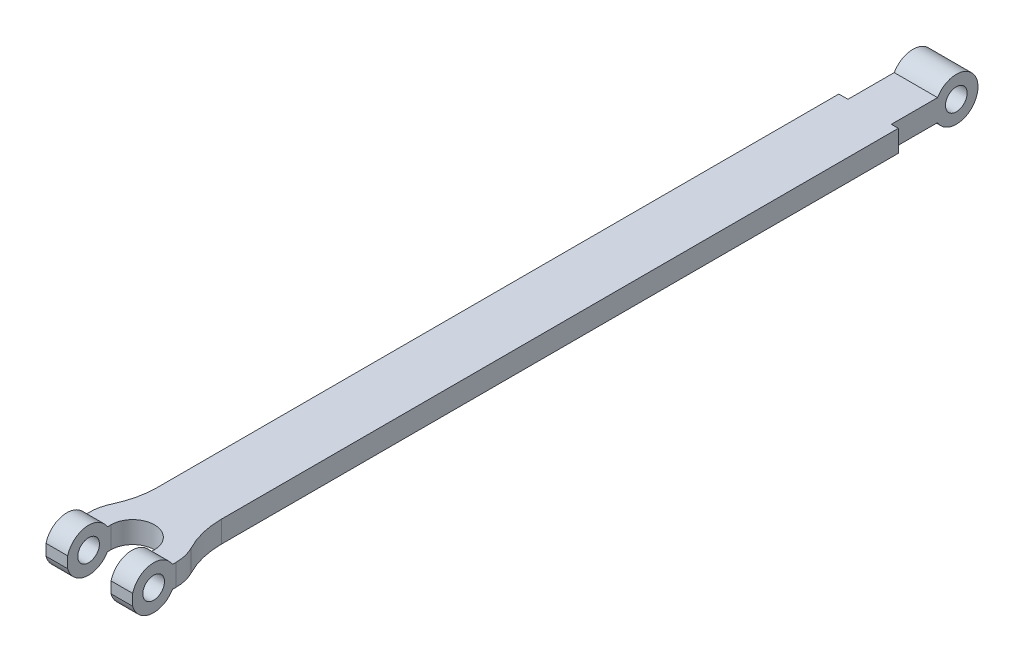
ISO-10303-21;
HEADER;
FILE_DESCRIPTION(('STEP AP214'),'2;1');
FILE_NAME('part.step','',(''),(''),'','','');
FILE_SCHEMA(('AUTOMOTIVE_DESIGN { 1 0 10303 214 1 1 1 1 }'));
ENDSEC;
DATA;
#1=APPLICATION_CONTEXT('core data for automotive mechanical design processes');
#2=APPLICATION_PROTOCOL_DEFINITION('international standard','automotive_design',2000,#1);
#3=PRODUCT_CONTEXT('',#1,'mechanical');
#4=PRODUCT('Part','Part','',(#3));
#5=PRODUCT_RELATED_PRODUCT_CATEGORY('part','',(#4));
#6=PRODUCT_DEFINITION_FORMATION('','',#4);
#7=PRODUCT_DEFINITION_CONTEXT('part definition',#1,'design');
#8=PRODUCT_DEFINITION('design','',#6,#7);
#9=PRODUCT_DEFINITION_SHAPE('','',#8);
#10=(LENGTH_UNIT() NAMED_UNIT(*) SI_UNIT(.MILLI.,.METRE.));
#11=(NAMED_UNIT(*) PLANE_ANGLE_UNIT() SI_UNIT($,.RADIAN.));
#12=(NAMED_UNIT(*) SI_UNIT($,.STERADIAN.) SOLID_ANGLE_UNIT());
#13=UNCERTAINTY_MEASURE_WITH_UNIT(LENGTH_MEASURE(1.E-05),#10,'distance_accuracy_value','');
#14=(GEOMETRIC_REPRESENTATION_CONTEXT(3) GLOBAL_UNCERTAINTY_ASSIGNED_CONTEXT((#13)) GLOBAL_UNIT_ASSIGNED_CONTEXT((#10,
#11,#12)) REPRESENTATION_CONTEXT('',''));
#15=CARTESIAN_POINT('',(0.,0.,0.));
#16=DIRECTION('',(0.,0.,1.));
#17=DIRECTION('',(1.,0.,0.));
#18=AXIS2_PLACEMENT_3D('',#15,#16,#17);
#19=CARTESIAN_POINT('',(-4.99999999999999,10.,0.));
#20=DIRECTION('',(-1.,0.,0.));
#21=DIRECTION('',(0.,0.,1.));
#22=AXIS2_PLACEMENT_3D('',#19,#20,#21);
#23=PLANE('',#22);
#24=CARTESIAN_POINT('',(-4.99999999999999,5.,-135.16461623257));
#25=DIRECTION('',(-1.,0.,0.));
#26=DIRECTION('',(0.,0.,1.));
#27=AXIS2_PLACEMENT_3D('',#24,#25,#26);
#28=CIRCLE('',#27,2.5);
#29=CARTESIAN_POINT('',(-4.99999999999999,5.,-132.66461623257));
#30=VERTEX_POINT('',#29);
#31=EDGE_CURVE('E390',#30,#30,#28,.T.);
#32=ORIENTED_EDGE('',*,*,#31,.F.);
#33=EDGE_LOOP('',(#32));
#34=FACE_BOUND('',#33,.T.);
#35=CARTESIAN_POINT('',(-4.99999999999999,5.,-135.16461623257));
#36=DIRECTION('',(-1.,0.,0.));
#37=DIRECTION('',(0.,0.,1.));
#38=AXIS2_PLACEMENT_3D('',#35,#36,#37);
#39=CIRCLE('',#38,4.99999999999999);
#40=CARTESIAN_POINT('',(-4.99999999999999,7.5,-130.834489213648));
#41=VERTEX_POINT('',#40);
#42=CARTESIAN_POINT('',(-4.99999999999999,2.50000000000001,-130.834489213648));
#43=VERTEX_POINT('',#42);
#44=EDGE_CURVE('E488',#41,#43,#39,.T.);
#45=ORIENTED_EDGE('',*,*,#44,.T.);
#46=DIRECTION('',(0.,0.,1.));
#47=VECTOR('',#46,1.);
#48=CARTESIAN_POINT('',(-4.99999999999999,2.5,0.));
#49=LINE('',#48,#47);
#50=CARTESIAN_POINT('',(-4.99999999999999,2.50000000000001,-120.16461623257));
#51=VERTEX_POINT('',#50);
#52=EDGE_CURVE('E386',#43,#51,#49,.T.);
#53=ORIENTED_EDGE('',*,*,#52,.T.);
#54=DIRECTION('',(0.,-1.,0.));
#55=VECTOR('',#54,1.);
#56=CARTESIAN_POINT('',(-4.99999999999999,10.,-120.16461623257));
#57=LINE('',#56,#55);
#58=CARTESIAN_POINT('',(-4.99999999999999,7.5,-120.16461623257));
#59=VERTEX_POINT('',#58);
#60=EDGE_CURVE('E548',#59,#51,#57,.T.);
#61=ORIENTED_EDGE('',*,*,#60,.F.);
#62=DIRECTION('',(0.,0.,1.));
#63=VECTOR('',#62,1.);
#64=CARTESIAN_POINT('',(-4.99999999999999,7.5,0.));
#65=LINE('',#64,#63);
#66=EDGE_CURVE('E457',#41,#59,#65,.T.);
#67=ORIENTED_EDGE('',*,*,#66,.F.);
#68=EDGE_LOOP('',(#45,#53,#61,#67));
#69=FACE_BOUND('',#68,.T.);
#70=ADVANCED_FACE('F158',(#34,#69),#23,.T.);
#71=CARTESIAN_POINT('',(-10.,10.,0.));
#72=DIRECTION('',(-1.,0.,0.));
#73=DIRECTION('',(0.,0.,1.));
#74=AXIS2_PLACEMENT_3D('',#71,#72,#73);
#75=PLANE('',#74);
#76=CARTESIAN_POINT('',(-10.,5.,55.0055015003828));
#77=DIRECTION('',(-1.,0.,0.));
#78=DIRECTION('',(0.,0.,1.));
#79=AXIS2_PLACEMENT_3D('',#76,#77,#78);
#80=CIRCLE('',#79,2.5);
#81=CARTESIAN_POINT('',(-10.,5.,57.5055015003828));
#82=VERTEX_POINT('',#81);
#83=EDGE_CURVE('E829',#82,#82,#80,.T.);
#84=ORIENTED_EDGE('',*,*,#83,.F.);
#85=EDGE_LOOP('',(#84));
#86=FACE_BOUND('',#85,.T.);
#87=DIRECTION('',(0.,-1.,0.));
#88=VECTOR('',#87,1.);
#89=CARTESIAN_POINT('',(-10.,10.,49.8353837674301));
#90=LINE('',#89,#88);
#91=CARTESIAN_POINT('',(-10.,7.5,49.8353837674301));
#92=VERTEX_POINT('',#91);
#93=CARTESIAN_POINT('',(-10.,2.5,49.8353837674301));
#94=VERTEX_POINT('',#93);
#95=EDGE_CURVE('E532',#92,#94,#90,.T.);
#96=ORIENTED_EDGE('',*,*,#95,.T.);
#97=DIRECTION('',(0.,0.,1.));
#98=VECTOR('',#97,1.);
#99=CARTESIAN_POINT('',(-10.,2.5,0.));
#100=LINE('',#99,#98);
#101=CARTESIAN_POINT('',(-10.,2.5,50.6753744814606));
#102=VERTEX_POINT('',#101);
#103=EDGE_CURVE('E334',#94,#102,#100,.T.);
#104=ORIENTED_EDGE('',*,*,#103,.T.);
#105=CARTESIAN_POINT('',(-10.,5.,55.0055015003828));
#106=DIRECTION('',(-1.,0.,0.));
#107=DIRECTION('',(0.,0.,1.));
#108=AXIS2_PLACEMENT_3D('',#105,#106,#107);
#109=CIRCLE('',#108,5.);
#110=CARTESIAN_POINT('',(-10.,3.70684985927299,59.8353837674301));
#111=VERTEX_POINT('',#110);
#112=EDGE_CURVE('E322',#102,#111,#109,.T.);
#113=ORIENTED_EDGE('',*,*,#112,.T.);
#114=DIRECTION('',(0.,-1.,0.));
#115=VECTOR('',#114,1.);
#116=CARTESIAN_POINT('',(-10.,10.,59.8353837674301));
#117=LINE('',#116,#115);
#118=CARTESIAN_POINT('',(-10.,6.29315014072701,59.8353837674301));
#119=VERTEX_POINT('',#118);
#120=EDGE_CURVE('E528',#119,#111,#117,.T.);
#121=ORIENTED_EDGE('',*,*,#120,.F.);
#122=CARTESIAN_POINT('',(-10.,5.,55.0055015003828));
#123=DIRECTION('',(-1.,0.,0.));
#124=DIRECTION('',(0.,0.,1.));
#125=AXIS2_PLACEMENT_3D('',#122,#123,#124);
#126=CIRCLE('',#125,5.);
#127=CARTESIAN_POINT('',(-10.,7.5,50.6753744814606));
#128=VERTEX_POINT('',#127);
#129=EDGE_CURVE('E463',#119,#128,#126,.T.);
#130=ORIENTED_EDGE('',*,*,#129,.T.);
#131=DIRECTION('',(0.,0.,1.));
#132=VECTOR('',#131,1.);
#133=CARTESIAN_POINT('',(-10.,7.5,0.));
#134=LINE('',#133,#132);
#135=EDGE_CURVE('E402',#92,#128,#134,.T.);
#136=ORIENTED_EDGE('',*,*,#135,.F.);
#137=EDGE_LOOP('',(#96,#104,#113,#121,#130,#136));
#138=FACE_BOUND('',#137,.T.);
#139=ADVANCED_FACE('F599',(#86,#138),#75,.T.);
#140=CARTESIAN_POINT('',(-4.99999999999999,10.,0.));
#141=DIRECTION('',(1.,0.,0.));
#142=DIRECTION('',(0.,0.,-1.));
#143=AXIS2_PLACEMENT_3D('',#140,#141,#142);
#144=PLANE('',#143);
#145=CARTESIAN_POINT('',(-4.99999999999999,5.,55.0055015003828));
#146=DIRECTION('',(1.,0.,0.));
#147=DIRECTION('',(0.,0.,-1.));
#148=AXIS2_PLACEMENT_3D('',#145,#146,#147);
#149=CIRCLE('',#148,2.5);
#150=CARTESIAN_POINT('',(-4.99999999999999,5.,52.5055015003828));
#151=VERTEX_POINT('',#150);
#152=EDGE_CURVE('E398',#151,#151,#149,.T.);
#153=ORIENTED_EDGE('',*,*,#152,.F.);
#154=EDGE_LOOP('',(#153));
#155=FACE_BOUND('',#154,.T.);
#156=CARTESIAN_POINT('',(-4.99999999999999,5.,55.0055015003828));
#157=DIRECTION('',(1.,0.,0.));
#158=DIRECTION('',(0.,0.,-1.));
#159=AXIS2_PLACEMENT_3D('',#156,#157,#158);
#160=CIRCLE('',#159,5.);
#161=CARTESIAN_POINT('',(-4.99999999999999,3.70684985927299,59.8353837674301));
#162=VERTEX_POINT('',#161);
#163=CARTESIAN_POINT('',(-4.99999999999999,2.5,50.6753744814606));
#164=VERTEX_POINT('',#163);
#165=EDGE_CURVE('E477',#162,#164,#160,.T.);
#166=ORIENTED_EDGE('',*,*,#165,.T.);
#167=DIRECTION('',(0.,0.,-1.));
#168=VECTOR('',#167,1.);
#169=CARTESIAN_POINT('',(-4.99999999999999,2.5,0.));
#170=LINE('',#169,#168);
#171=CARTESIAN_POINT('',(-4.99999999999999,2.5,49.8353837674301));
#172=VERTEX_POINT('',#171);
#173=EDGE_CURVE('E367',#164,#172,#170,.T.);
#174=ORIENTED_EDGE('',*,*,#173,.T.);
#175=DIRECTION('',(0.,-1.,0.));
#176=VECTOR('',#175,1.);
#177=CARTESIAN_POINT('',(-4.99999999999999,10.,49.8353837674301));
#178=LINE('',#177,#176);
#179=CARTESIAN_POINT('',(-4.99999999999999,7.5,49.8353837674301));
#180=VERTEX_POINT('',#179);
#181=EDGE_CURVE('E520',#180,#172,#178,.T.);
#182=ORIENTED_EDGE('',*,*,#181,.F.);
#183=DIRECTION('',(0.,0.,-1.));
#184=VECTOR('',#183,1.);
#185=CARTESIAN_POINT('',(-4.99999999999999,7.5,0.));
#186=LINE('',#185,#184);
#187=CARTESIAN_POINT('',(-4.99999999999999,7.5,50.6753744814606));
#188=VERTEX_POINT('',#187);
#189=EDGE_CURVE('E441',#188,#180,#186,.T.);
#190=ORIENTED_EDGE('',*,*,#189,.F.);
#191=CARTESIAN_POINT('',(-4.99999999999999,5.,55.0055015003828));
#192=DIRECTION('',(1.,0.,0.));
#193=DIRECTION('',(0.,0.,-1.));
#194=AXIS2_PLACEMENT_3D('',#191,#192,#193);
#195=CIRCLE('',#194,5.);
#196=CARTESIAN_POINT('',(-4.99999999999999,6.29315014072701,59.8353837674301));
#197=VERTEX_POINT('',#196);
#198=EDGE_CURVE('E482',#188,#197,#195,.T.);
#199=ORIENTED_EDGE('',*,*,#198,.T.);
#200=DIRECTION('',(0.,-1.,0.));
#201=VECTOR('',#200,1.);
#202=CARTESIAN_POINT('',(-4.99999999999999,10.,59.8353837674301));
#203=LINE('',#202,#201);
#204=EDGE_CURVE('E524',#197,#162,#203,.T.);
#205=ORIENTED_EDGE('',*,*,#204,.T.);
#206=EDGE_LOOP('',(#166,#174,#182,#190,#199,#205));
#207=FACE_BOUND('',#206,.T.);
#208=ADVANCED_FACE('F591',(#155,#207),#144,.T.);
#209=CARTESIAN_POINT('',(5.00000000000001,10.,0.));
#210=DIRECTION('',(1.,0.,0.));
#211=DIRECTION('',(0.,0.,-1.));
#212=AXIS2_PLACEMENT_3D('',#209,#210,#211);
#213=PLANE('',#212);
#214=CARTESIAN_POINT('',(5.00000000000002,5.,55.0055015003828));
#215=DIRECTION('',(1.,0.,0.));
#216=DIRECTION('',(0.,0.,-1.));
#217=AXIS2_PLACEMENT_3D('',#214,#215,#216);
#218=CIRCLE('',#217,2.5);
#219=CARTESIAN_POINT('',(5.00000000000002,5.,52.5055015003828));
#220=VERTEX_POINT('',#219);
#221=EDGE_CURVE('E394',#220,#220,#218,.T.);
#222=ORIENTED_EDGE('',*,*,#221,.T.);
#223=EDGE_LOOP('',(#222));
#224=FACE_BOUND('',#223,.T.);
#225=DIRECTION('',(0.,0.,-1.));
#226=VECTOR('',#225,1.);
#227=CARTESIAN_POINT('',(5.00000000000001,2.5,0.));
#228=LINE('',#227,#226);
#229=CARTESIAN_POINT('',(5.00000000000002,2.5,50.6753744814606));
#230=VERTEX_POINT('',#229);
#231=CARTESIAN_POINT('',(5.00000000000001,2.5,49.8353837674301));
#232=VERTEX_POINT('',#231);
#233=EDGE_CURVE('E364',#230,#232,#228,.T.);
#234=ORIENTED_EDGE('',*,*,#233,.F.);
#235=CARTESIAN_POINT('',(5.00000000000002,5.,55.0055015003828));
#236=DIRECTION('',(1.,0.,0.));
#237=DIRECTION('',(0.,0.,-1.));
#238=AXIS2_PLACEMENT_3D('',#235,#236,#237);
#239=CIRCLE('',#238,5.);
#240=CARTESIAN_POINT('',(5.00000000000002,3.70684985927299,59.8353837674301));
#241=VERTEX_POINT('',#240);
#242=EDGE_CURVE('E338',#241,#230,#239,.T.);
#243=ORIENTED_EDGE('',*,*,#242,.F.);
#244=DIRECTION('',(0.,-1.,0.));
#245=VECTOR('',#244,1.);
#246=CARTESIAN_POINT('',(5.00000000000002,10.,59.8353837674301));
#247=LINE('',#246,#245);
#248=CARTESIAN_POINT('',(5.00000000000002,6.29315014072701,59.8353837674301));
#249=VERTEX_POINT('',#248);
#250=EDGE_CURVE('E512',#249,#241,#247,.T.);
#251=ORIENTED_EDGE('',*,*,#250,.F.);
#252=CARTESIAN_POINT('',(5.00000000000002,5.,55.0055015003828));
#253=DIRECTION('',(1.,0.,0.));
#254=DIRECTION('',(0.,0.,-1.));
#255=AXIS2_PLACEMENT_3D('',#252,#253,#254);
#256=CIRCLE('',#255,5.);
#257=CARTESIAN_POINT('',(5.00000000000001,7.5,50.6753744814606));
#258=VERTEX_POINT('',#257);
#259=EDGE_CURVE('E182',#258,#249,#256,.T.);
#260=ORIENTED_EDGE('',*,*,#259,.F.);
#261=DIRECTION('',(0.,0.,-1.));
#262=VECTOR('',#261,1.);
#263=CARTESIAN_POINT('',(5.00000000000001,7.5,0.));
#264=LINE('',#263,#262);
#265=CARTESIAN_POINT('',(5.00000000000001,7.5,49.8353837674301));
#266=VERTEX_POINT('',#265);
#267=EDGE_CURVE('E437',#258,#266,#264,.T.);
#268=ORIENTED_EDGE('',*,*,#267,.T.);
#269=DIRECTION('',(0.,-1.,0.));
#270=VECTOR('',#269,1.);
#271=CARTESIAN_POINT('',(5.00000000000001,10.,49.8353837674301));
#272=LINE('',#271,#270);
#273=EDGE_CURVE('E516',#266,#232,#272,.T.);
#274=ORIENTED_EDGE('',*,*,#273,.T.);
#275=EDGE_LOOP('',(#234,#243,#251,#260,#268,#274));
#276=FACE_BOUND('',#275,.T.);
#277=ADVANCED_FACE('F582',(#224,#276),#213,.F.);
#278=CARTESIAN_POINT('',(10.,10.,0.));
#279=DIRECTION('',(-1.,0.,0.));
#280=DIRECTION('',(0.,0.,1.));
#281=AXIS2_PLACEMENT_3D('',#278,#279,#280);
#282=PLANE('',#281);
#283=CARTESIAN_POINT('',(10.,5.,55.0055015003828));
#284=DIRECTION('',(-1.,0.,0.));
#285=DIRECTION('',(0.,0.,1.));
#286=AXIS2_PLACEMENT_3D('',#283,#284,#285);
#287=CIRCLE('',#286,2.5);
#288=CARTESIAN_POINT('',(10.,5.,57.5055015003828));
#289=VERTEX_POINT('',#288);
#290=EDGE_CURVE('E831',#289,#289,#287,.T.);
#291=ORIENTED_EDGE('',*,*,#290,.T.);
#292=EDGE_LOOP('',(#291));
#293=FACE_BOUND('',#292,.T.);
#294=DIRECTION('',(0.,0.,1.));
#295=VECTOR('',#294,1.);
#296=CARTESIAN_POINT('',(10.,2.5,0.));
#297=LINE('',#296,#295);
#298=CARTESIAN_POINT('',(10.,2.5,49.8353837674301));
#299=VERTEX_POINT('',#298);
#300=CARTESIAN_POINT('',(10.,2.5,50.6753744814606));
#301=VERTEX_POINT('',#300);
#302=EDGE_CURVE('E312',#299,#301,#297,.T.);
#303=ORIENTED_EDGE('',*,*,#302,.F.);
#304=DIRECTION('',(0.,-1.,0.));
#305=VECTOR('',#304,1.);
#306=CARTESIAN_POINT('',(10.,10.,49.8353837674301));
#307=LINE('',#306,#305);
#308=CARTESIAN_POINT('',(10.,7.5,49.8353837674301));
#309=VERTEX_POINT('',#308);
#310=EDGE_CURVE('E507',#309,#299,#307,.T.);
#311=ORIENTED_EDGE('',*,*,#310,.F.);
#312=DIRECTION('',(0.,0.,1.));
#313=VECTOR('',#312,1.);
#314=CARTESIAN_POINT('',(10.,7.5,0.));
#315=LINE('',#314,#313);
#316=CARTESIAN_POINT('',(10.,7.5,50.6753744814606));
#317=VERTEX_POINT('',#316);
#318=EDGE_CURVE('E403',#309,#317,#315,.T.);
#319=ORIENTED_EDGE('',*,*,#318,.T.);
#320=CARTESIAN_POINT('',(10.,5.,55.0055015003828));
#321=DIRECTION('',(-1.,0.,0.));
#322=DIRECTION('',(0.,0.,1.));
#323=AXIS2_PLACEMENT_3D('',#320,#321,#322);
#324=CIRCLE('',#323,5.);
#325=CARTESIAN_POINT('',(10.,6.29315014072701,59.8353837674301));
#326=VERTEX_POINT('',#325);
#327=EDGE_CURVE('E460',#326,#317,#324,.T.);
#328=ORIENTED_EDGE('',*,*,#327,.F.);
#329=DIRECTION('',(0.,-1.,0.));
#330=VECTOR('',#329,1.);
#331=CARTESIAN_POINT('',(10.,10.,59.8353837674301));
#332=LINE('',#331,#330);
#333=CARTESIAN_POINT('',(10.,3.70684985927299,59.8353837674301));
#334=VERTEX_POINT('',#333);
#335=EDGE_CURVE('E316',#326,#334,#332,.T.);
#336=ORIENTED_EDGE('',*,*,#335,.T.);
#337=CARTESIAN_POINT('',(10.,5.,55.0055015003828));
#338=DIRECTION('',(-1.,0.,0.));
#339=DIRECTION('',(0.,0.,1.));
#340=AXIS2_PLACEMENT_3D('',#337,#338,#339);
#341=CIRCLE('',#340,5.);
#342=EDGE_CURVE('E308',#301,#334,#341,.T.);
#343=ORIENTED_EDGE('',*,*,#342,.F.);
#344=EDGE_LOOP('',(#303,#311,#319,#328,#336,#343));
#345=FACE_BOUND('',#344,.T.);
#346=ADVANCED_FACE('F310',(#293,#345),#282,.F.);
#347=CARTESIAN_POINT('',(4.99999999999999,10.,0.));
#348=DIRECTION('',(-1.,0.,0.));
#349=DIRECTION('',(0.,0.,1.));
#350=AXIS2_PLACEMENT_3D('',#347,#348,#349);
#351=PLANE('',#350);
#352=CARTESIAN_POINT('',(4.99999999999999,5.,-135.16461623257));
#353=DIRECTION('',(-1.,0.,0.));
#354=DIRECTION('',(0.,0.,1.));
#355=AXIS2_PLACEMENT_3D('',#352,#353,#354);
#356=CIRCLE('',#355,2.5);
#357=CARTESIAN_POINT('',(4.99999999999999,5.,-132.66461623257));
#358=VERTEX_POINT('',#357);
#359=EDGE_CURVE('E161',#358,#358,#356,.T.);
#360=ORIENTED_EDGE('',*,*,#359,.T.);
#361=EDGE_LOOP('',(#360));
#362=FACE_BOUND('',#361,.T.);
#363=DIRECTION('',(0.,0.,1.));
#364=VECTOR('',#363,1.);
#365=CARTESIAN_POINT('',(4.99999999999999,2.5,0.));
#366=LINE('',#365,#364);
#367=CARTESIAN_POINT('',(4.99999999999999,2.50000000000001,-130.834489213648));
#368=VERTEX_POINT('',#367);
#369=CARTESIAN_POINT('',(4.99999999999999,2.50000000000001,-120.16461623257));
#370=VERTEX_POINT('',#369);
#371=EDGE_CURVE('E357',#368,#370,#366,.T.);
#372=ORIENTED_EDGE('',*,*,#371,.F.);
#373=CARTESIAN_POINT('',(4.99999999999999,5.,-135.16461623257));
#374=DIRECTION('',(-1.,0.,0.));
#375=DIRECTION('',(0.,0.,1.));
#376=AXIS2_PLACEMENT_3D('',#373,#374,#375);
#377=CIRCLE('',#376,4.99999999999999);
#378=CARTESIAN_POINT('',(4.99999999999999,7.5,-130.834489213648));
#379=VERTEX_POINT('',#378);
#380=EDGE_CURVE('E485',#379,#368,#377,.T.);
#381=ORIENTED_EDGE('',*,*,#380,.F.);
#382=DIRECTION('',(0.,0.,1.));
#383=VECTOR('',#382,1.);
#384=CARTESIAN_POINT('',(4.99999999999999,7.5,0.));
#385=LINE('',#384,#383);
#386=CARTESIAN_POINT('',(4.99999999999999,7.5,-120.16461623257));
#387=VERTEX_POINT('',#386);
#388=EDGE_CURVE('E430',#379,#387,#385,.T.);
#389=ORIENTED_EDGE('',*,*,#388,.T.);
#390=DIRECTION('',(0.,-1.,0.));
#391=VECTOR('',#390,1.);
#392=CARTESIAN_POINT('',(4.99999999999999,10.,-120.16461623257));
#393=LINE('',#392,#391);
#394=EDGE_CURVE('E491',#387,#370,#393,.T.);
#395=ORIENTED_EDGE('',*,*,#394,.T.);
#396=EDGE_LOOP('',(#372,#381,#389,#395));
#397=FACE_BOUND('',#396,.T.);
#398=ADVANCED_FACE('F563',(#362,#397),#351,.F.);
#399=CARTESIAN_POINT('',(1.58389734865579E-12,10.,-120.16461623257));
#400=DIRECTION('',(0.,0.,-1.));
#401=DIRECTION('',(-1.,0.,0.));
#402=AXIS2_PLACEMENT_3D('',#399,#400,#401);
#403=PLANE('',#402);
#404=ORIENTED_EDGE('',*,*,#60,.T.);
#405=DIRECTION('',(-1.,0.,0.));
#406=VECTOR('',#405,1.);
#407=CARTESIAN_POINT('',(1.58389734865579E-12,2.50000000000001,-120.16461623257));
#408=LINE('',#407,#406);
#409=CARTESIAN_POINT('',(-7.10571606486786,2.50000000000001,-120.16461623257));
#410=VERTEX_POINT('',#409);
#411=EDGE_CURVE('E382',#51,#410,#408,.T.);
#412=ORIENTED_EDGE('',*,*,#411,.T.);
#413=DIRECTION('',(0.,-1.,0.));
#414=VECTOR('',#413,1.);
#415=CARTESIAN_POINT('',(-7.10571606486786,10.,-120.16461623257));
#416=LINE('',#415,#414);
#417=CARTESIAN_POINT('',(-7.10571606486786,7.5,-120.16461623257));
#418=VERTEX_POINT('',#417);
#419=EDGE_CURVE('E544',#418,#410,#416,.T.);
#420=ORIENTED_EDGE('',*,*,#419,.F.);
#421=DIRECTION('',(-1.,0.,0.));
#422=VECTOR('',#421,1.);
#423=CARTESIAN_POINT('',(1.58389734865579E-12,7.5,-120.16461623257));
#424=LINE('',#423,#422);
#425=EDGE_CURVE('E454',#59,#418,#424,.T.);
#426=ORIENTED_EDGE('',*,*,#425,.F.);
#427=EDGE_LOOP('',(#404,#412,#420,#426));
#428=FACE_BOUND('',#427,.T.);
#429=ADVANCED_FACE('F643',(#428),#403,.T.);
#430=CARTESIAN_POINT('',(-7.10571606486786,10.,0.));
#431=DIRECTION('',(-1.,0.,0.));
#432=DIRECTION('',(0.,0.,1.));
#433=AXIS2_PLACEMENT_3D('',#430,#431,#432);
#434=PLANE('',#433);
#435=ORIENTED_EDGE('',*,*,#419,.T.);
#436=DIRECTION('',(0.,0.,1.));
#437=VECTOR('',#436,1.);
#438=CARTESIAN_POINT('',(-7.10571606486786,2.5,0.));
#439=LINE('',#438,#437);
#440=CARTESIAN_POINT('',(-7.10571606486786,2.5,36.9792507325411));
#441=VERTEX_POINT('',#440);
#442=EDGE_CURVE('E378',#410,#441,#439,.T.);
#443=ORIENTED_EDGE('',*,*,#442,.T.);
#444=DIRECTION('',(0.,-1.,0.));
#445=VECTOR('',#444,1.);
#446=CARTESIAN_POINT('',(-7.10571606486786,10.,36.9792507325411));
#447=LINE('',#446,#445);
#448=CARTESIAN_POINT('',(-7.10571606486786,7.5,36.9792507325411));
#449=VERTEX_POINT('',#448);
#450=EDGE_CURVE('E540',#449,#441,#447,.T.);
#451=ORIENTED_EDGE('',*,*,#450,.F.);
#452=DIRECTION('',(0.,0.,1.));
#453=VECTOR('',#452,1.);
#454=CARTESIAN_POINT('',(-7.10571606486786,7.5,0.));
#455=LINE('',#454,#453);
#456=EDGE_CURVE('E451',#418,#449,#455,.T.);
#457=ORIENTED_EDGE('',*,*,#456,.F.);
#458=EDGE_LOOP('',(#435,#443,#451,#457));
#459=FACE_BOUND('',#458,.T.);
#460=ADVANCED_FACE('F645',(#459),#434,.T.);
#461=CARTESIAN_POINT('',(-27.1057160648679,10.,36.9792507325411));
#462=DIRECTION('',(0.,-1.,0.));
#463=DIRECTION('',(0.,0.,-1.));
#464=AXIS2_PLACEMENT_3D('',#461,#462,#463);
#465=CYLINDRICAL_SURFACE('',#464,20.);
#466=ORIENTED_EDGE('',*,*,#450,.T.);
#467=CARTESIAN_POINT('',(-27.1057160648679,2.5,36.9792507325411));
#468=DIRECTION('',(0.,-1.,0.));
#469=DIRECTION('',(0.,0.,-1.));
#470=AXIS2_PLACEMENT_3D('',#467,#468,#469);
#471=CIRCLE('',#470,20.);
#472=CARTESIAN_POINT('',(-9.03523868828929,2.5,45.5500060891338));
#473=VERTEX_POINT('',#472);
#474=EDGE_CURVE('E374',#441,#473,#471,.T.);
#475=ORIENTED_EDGE('',*,*,#474,.T.);
#476=DIRECTION('',(0.,-1.,0.));
#477=VECTOR('',#476,1.);
#478=CARTESIAN_POINT('',(-9.03523868828929,10.,45.5500060891338));
#479=LINE('',#478,#477);
#480=CARTESIAN_POINT('',(-9.03523868828929,7.5,45.5500060891338));
#481=VERTEX_POINT('',#480);
#482=EDGE_CURVE('E536',#481,#473,#479,.T.);
#483=ORIENTED_EDGE('',*,*,#482,.F.);
#484=CARTESIAN_POINT('',(-27.1057160648679,7.5,36.9792507325411));
#485=DIRECTION('',(0.,-1.,0.));
#486=DIRECTION('',(0.,0.,-1.));
#487=AXIS2_PLACEMENT_3D('',#484,#485,#486);
#488=CIRCLE('',#487,20.);
#489=EDGE_CURVE('E448',#449,#481,#488,.T.);
#490=ORIENTED_EDGE('',*,*,#489,.F.);
#491=EDGE_LOOP('',(#466,#475,#483,#490));
#492=FACE_BOUND('',#491,.T.);
#493=ADVANCED_FACE('F650',(#492),#465,.F.);
#494=CARTESIAN_POINT('',(0.,10.,49.8353837674301));
#495=DIRECTION('',(0.,-1.,0.));
#496=DIRECTION('',(0.,0.,-1.));
#497=AXIS2_PLACEMENT_3D('',#494,#495,#496);
#498=CYLINDRICAL_SURFACE('',#497,10.);
#499=CARTESIAN_POINT('',(0.,2.5,49.8353837674301));
#500=DIRECTION('',(0.,-1.,0.));
#501=DIRECTION('',(0.,0.,-1.));
#502=AXIS2_PLACEMENT_3D('',#499,#500,#501);
#503=CIRCLE('',#502,10.);
#504=EDGE_CURVE('E371',#94,#473,#503,.T.);
#505=ORIENTED_EDGE('',*,*,#504,.F.);
#506=ORIENTED_EDGE('',*,*,#95,.F.);
#507=CARTESIAN_POINT('',(0.,7.5,49.8353837674301));
#508=DIRECTION('',(0.,-1.,0.));
#509=DIRECTION('',(0.,0.,-1.));
#510=AXIS2_PLACEMENT_3D('',#507,#508,#509);
#511=CIRCLE('',#510,10.);
#512=EDGE_CURVE('E444',#92,#481,#511,.T.);
#513=ORIENTED_EDGE('',*,*,#512,.T.);
#514=ORIENTED_EDGE('',*,*,#482,.T.);
#515=EDGE_LOOP('',(#505,#506,#513,#514));
#516=FACE_BOUND('',#515,.T.);
#517=ADVANCED_FACE('F653',(#516),#498,.T.);
#518=CARTESIAN_POINT('',(0.,10.,49.8353837674301));
#519=DIRECTION('',(0.,-1.,0.));
#520=DIRECTION('',(0.,0.,-1.));
#521=AXIS2_PLACEMENT_3D('',#518,#519,#520);
#522=CYLINDRICAL_SURFACE('',#521,5.);
#523=ORIENTED_EDGE('',*,*,#181,.T.);
#524=CARTESIAN_POINT('',(0.,2.5,49.8353837674301));
#525=DIRECTION('',(0.,-1.,0.));
#526=DIRECTION('',(0.,0.,-1.));
#527=AXIS2_PLACEMENT_3D('',#524,#525,#526);
#528=CIRCLE('',#527,5.);
#529=EDGE_CURVE('E360',#172,#232,#528,.T.);
#530=ORIENTED_EDGE('',*,*,#529,.T.);
#531=ORIENTED_EDGE('',*,*,#273,.F.);
#532=CARTESIAN_POINT('',(0.,7.5,49.8353837674301));
#533=DIRECTION('',(0.,-1.,0.));
#534=DIRECTION('',(0.,0.,-1.));
#535=AXIS2_PLACEMENT_3D('',#532,#533,#534);
#536=CIRCLE('',#535,5.);
#537=EDGE_CURVE('E434',#180,#266,#536,.T.);
#538=ORIENTED_EDGE('',*,*,#537,.F.);
#539=EDGE_LOOP('',(#523,#530,#531,#538));
#540=FACE_BOUND('',#539,.T.);
#541=ADVANCED_FACE('F586',(#540),#522,.F.);
#542=CARTESIAN_POINT('',(0.,10.,49.8353837674301));
#543=DIRECTION('',(0.,-1.,0.));
#544=DIRECTION('',(0.,0.,-1.));
#545=AXIS2_PLACEMENT_3D('',#542,#543,#544);
#546=CYLINDRICAL_SURFACE('',#545,10.);
#547=CARTESIAN_POINT('',(0.,2.5,49.8353837674301));
#548=DIRECTION('',(0.,-1.,0.));
#549=DIRECTION('',(0.,0.,-1.));
#550=AXIS2_PLACEMENT_3D('',#547,#548,#549);
#551=CIRCLE('',#550,10.);
#552=CARTESIAN_POINT('',(8.86968677632821,2.5,45.2170879248244));
#553=VERTEX_POINT('',#552);
#554=EDGE_CURVE('E331',#553,#299,#551,.T.);
#555=ORIENTED_EDGE('',*,*,#554,.F.);
#556=DIRECTION('',(0.,-1.,0.));
#557=VECTOR('',#556,1.);
#558=CARTESIAN_POINT('',(8.86968677632821,10.,45.2170879248244));
#559=LINE('',#558,#557);
#560=CARTESIAN_POINT('',(8.86968677632821,7.5,45.2170879248244));
#561=VERTEX_POINT('',#560);
#562=EDGE_CURVE('E503',#561,#553,#559,.T.);
#563=ORIENTED_EDGE('',*,*,#562,.F.);
#564=CARTESIAN_POINT('',(0.,7.5,49.8353837674301));
#565=DIRECTION('',(0.,-1.,0.));
#566=DIRECTION('',(0.,0.,-1.));
#567=AXIS2_PLACEMENT_3D('',#564,#565,#566);
#568=CIRCLE('',#567,10.);
#569=EDGE_CURVE('E426',#561,#309,#568,.T.);
#570=ORIENTED_EDGE('',*,*,#569,.T.);
#571=ORIENTED_EDGE('',*,*,#310,.T.);
#572=EDGE_LOOP('',(#555,#563,#570,#571));
#573=FACE_BOUND('',#572,.T.);
#574=ADVANCED_FACE('F574',(#573),#546,.T.);
#575=CARTESIAN_POINT('',(26.6090603289846,10.,35.980496239613));
#576=DIRECTION('',(0.,-1.,0.));
#577=DIRECTION('',(0.,0.,-1.));
#578=AXIS2_PLACEMENT_3D('',#575,#576,#577);
#579=CYLINDRICAL_SURFACE('',#578,20.);
#580=CARTESIAN_POINT('',(26.6090603289846,2.5,35.980496239613));
#581=DIRECTION('',(0.,-1.,0.));
#582=DIRECTION('',(0.,0.,-1.));
#583=AXIS2_PLACEMENT_3D('',#580,#581,#582);
#584=CIRCLE('',#583,20.);
#585=CARTESIAN_POINT('',(6.60906032898456,2.5,35.980496239613));
#586=VERTEX_POINT('',#585);
#587=EDGE_CURVE('E352',#586,#553,#584,.F.);
#588=ORIENTED_EDGE('',*,*,#587,.F.);
#589=DIRECTION('',(0.,-1.,0.));
#590=VECTOR('',#589,1.);
#591=CARTESIAN_POINT('',(6.60906032898456,10.,35.980496239613));
#592=LINE('',#591,#590);
#593=CARTESIAN_POINT('',(6.60906032898456,7.5,35.980496239613));
#594=VERTEX_POINT('',#593);
#595=EDGE_CURVE('E499',#594,#586,#592,.T.);
#596=ORIENTED_EDGE('',*,*,#595,.F.);
#597=CARTESIAN_POINT('',(26.6090603289846,7.5,35.980496239613));
#598=DIRECTION('',(0.,-1.,0.));
#599=DIRECTION('',(0.,0.,-1.));
#600=AXIS2_PLACEMENT_3D('',#597,#598,#599);
#601=CIRCLE('',#600,20.);
#602=EDGE_CURVE('E422',#594,#561,#601,.F.);
#603=ORIENTED_EDGE('',*,*,#602,.T.);
#604=ORIENTED_EDGE('',*,*,#562,.T.);
#605=EDGE_LOOP('',(#588,#596,#603,#604));
#606=FACE_BOUND('',#605,.T.);
#607=ADVANCED_FACE('F571',(#606),#579,.F.);
#608=CARTESIAN_POINT('',(6.60906032898456,10.,0.));
#609=DIRECTION('',(-1.,0.,0.));
#610=DIRECTION('',(0.,0.,1.));
#611=AXIS2_PLACEMENT_3D('',#608,#609,#610);
#612=PLANE('',#611);
#613=DIRECTION('',(0.,0.,1.));
#614=VECTOR('',#613,1.);
#615=CARTESIAN_POINT('',(6.60906032898456,2.5,0.));
#616=LINE('',#615,#614);
#617=CARTESIAN_POINT('',(6.60906032898456,2.50000000000001,-120.16461623257));
#618=VERTEX_POINT('',#617);
#619=EDGE_CURVE('E345',#618,#586,#616,.T.);
#620=ORIENTED_EDGE('',*,*,#619,.F.);
#621=DIRECTION('',(0.,-1.,0.));
#622=VECTOR('',#621,1.);
#623=CARTESIAN_POINT('',(6.60906032898456,10.,-120.16461623257));
#624=LINE('',#623,#622);
#625=CARTESIAN_POINT('',(6.60906032898456,7.5,-120.16461623257));
#626=VERTEX_POINT('',#625);
#627=EDGE_CURVE('E495',#626,#618,#624,.T.);
#628=ORIENTED_EDGE('',*,*,#627,.F.);
#629=DIRECTION('',(0.,0.,1.));
#630=VECTOR('',#629,1.);
#631=CARTESIAN_POINT('',(6.60906032898456,7.5,0.));
#632=LINE('',#631,#630);
#633=EDGE_CURVE('E414',#626,#594,#632,.T.);
#634=ORIENTED_EDGE('',*,*,#633,.T.);
#635=ORIENTED_EDGE('',*,*,#595,.T.);
#636=EDGE_LOOP('',(#620,#628,#634,#635));
#637=FACE_BOUND('',#636,.T.);
#638=ADVANCED_FACE('F568',(#637),#612,.F.);
#639=CARTESIAN_POINT('',(1.03639311469163E-12,10.,-120.16461623257));
#640=DIRECTION('',(0.,0.,-1.));
#641=DIRECTION('',(-1.,0.,0.));
#642=AXIS2_PLACEMENT_3D('',#639,#640,#641);
#643=PLANE('',#642);
#644=ORIENTED_EDGE('',*,*,#627,.T.);
#645=DIRECTION('',(-1.,0.,0.));
#646=VECTOR('',#645,1.);
#647=CARTESIAN_POINT('',(1.03639311469163E-12,2.50000000000001,-120.16461623257));
#648=LINE('',#647,#646);
#649=EDGE_CURVE('E12',#618,#370,#648,.T.);
#650=ORIENTED_EDGE('',*,*,#649,.T.);
#651=ORIENTED_EDGE('',*,*,#394,.F.);
#652=DIRECTION('',(-1.,0.,0.));
#653=VECTOR('',#652,1.);
#654=CARTESIAN_POINT('',(1.03639311469163E-12,7.5,-120.16461623257));
#655=LINE('',#654,#653);
#656=EDGE_CURVE('E167',#626,#387,#655,.T.);
#657=ORIENTED_EDGE('',*,*,#656,.F.);
#658=EDGE_LOOP('',(#644,#650,#651,#657));
#659=FACE_BOUND('',#658,.T.);
#660=ADVANCED_FACE('F564',(#659),#643,.T.);
#661=CARTESIAN_POINT('',(0.,10.,59.8353837674301));
#662=DIRECTION('',(0.,0.,1.));
#663=DIRECTION('',(1.,0.,0.));
#664=AXIS2_PLACEMENT_3D('',#661,#662,#663);
#665=PLANE('',#664);
#666=ORIENTED_EDGE('',*,*,#204,.F.);
#667=DIRECTION('',(-1.,0.,0.));
#668=VECTOR('',#667,1.);
#669=CARTESIAN_POINT('',(10.,6.29315014072701,59.8353837674301));
#670=LINE('',#669,#668);
#671=EDGE_CURVE('E174',#197,#119,#670,.T.);
#672=ORIENTED_EDGE('',*,*,#671,.T.);
#673=ORIENTED_EDGE('',*,*,#120,.T.);
#674=DIRECTION('',(-1.,0.,0.));
#675=VECTOR('',#674,1.);
#676=CARTESIAN_POINT('',(10.,3.70684985927299,59.8353837674301));
#677=LINE('',#676,#675);
#678=EDGE_CURVE('E321',#162,#111,#677,.T.);
#679=ORIENTED_EDGE('',*,*,#678,.F.);
#680=EDGE_LOOP('',(#666,#672,#673,#679));
#681=FACE_BOUND('',#680,.T.);
#682=ADVANCED_FACE('F602',(#681),#665,.T.);
#683=CARTESIAN_POINT('',(0.,10.,59.8353837674301));
#684=DIRECTION('',(0.,0.,1.));
#685=DIRECTION('',(1.,0.,0.));
#686=AXIS2_PLACEMENT_3D('',#683,#684,#685);
#687=PLANE('',#686);
#688=ORIENTED_EDGE('',*,*,#335,.F.);
#689=EDGE_CURVE('E467',#326,#249,#670,.T.);
#690=ORIENTED_EDGE('',*,*,#689,.T.);
#691=ORIENTED_EDGE('',*,*,#250,.T.);
#692=EDGE_CURVE('E466',#334,#241,#677,.T.);
#693=ORIENTED_EDGE('',*,*,#692,.F.);
#694=EDGE_LOOP('',(#688,#690,#691,#693));
#695=FACE_BOUND('',#694,.T.);
#696=ADVANCED_FACE('F580',(#695),#687,.T.);
#697=CARTESIAN_POINT('',(10.,5.,55.0055015003828));
#698=DIRECTION('',(-1.,0.,0.));
#699=DIRECTION('',(0.,0.,1.));
#700=AXIS2_PLACEMENT_3D('',#697,#698,#699);
#701=CYLINDRICAL_SURFACE('',#700,5.);
#702=ORIENTED_EDGE('',*,*,#678,.T.);
#703=ORIENTED_EDGE('',*,*,#112,.F.);
#704=DIRECTION('',(-1.,0.,0.));
#705=VECTOR('',#704,1.);
#706=CARTESIAN_POINT('',(10.,2.5,50.6753744814606));
#707=LINE('',#706,#705);
#708=EDGE_CURVE('E333',#164,#102,#707,.T.);
#709=ORIENTED_EDGE('',*,*,#708,.F.);
#710=ORIENTED_EDGE('',*,*,#165,.F.);
#711=EDGE_LOOP('',(#702,#703,#709,#710));
#712=FACE_BOUND('',#711,.T.);
#713=ADVANCED_FACE('F595',(#712),#701,.T.);
#714=ORIENTED_EDGE('',*,*,#242,.T.);
#715=EDGE_CURVE('E328',#301,#230,#707,.T.);
#716=ORIENTED_EDGE('',*,*,#715,.F.);
#717=ORIENTED_EDGE('',*,*,#342,.T.);
#718=ORIENTED_EDGE('',*,*,#692,.T.);
#719=EDGE_LOOP('',(#714,#716,#717,#718));
#720=FACE_BOUND('',#719,.T.);
#721=ADVANCED_FACE('F336',(#720),#701,.T.);
#722=CARTESIAN_POINT('',(10.,5.,55.0055015003828));
#723=DIRECTION('',(-1.,0.,0.));
#724=DIRECTION('',(0.,0.,1.));
#725=AXIS2_PLACEMENT_3D('',#722,#723,#724);
#726=CYLINDRICAL_SURFACE('',#725,5.);
#727=ORIENTED_EDGE('',*,*,#198,.F.);
#728=DIRECTION('',(-1.,0.,0.));
#729=VECTOR('',#728,1.);
#730=CARTESIAN_POINT('',(10.,7.5,50.6753744814606));
#731=LINE('',#730,#729);
#732=EDGE_CURVE('E415',#188,#128,#731,.T.);
#733=ORIENTED_EDGE('',*,*,#732,.T.);
#734=ORIENTED_EDGE('',*,*,#129,.F.);
#735=ORIENTED_EDGE('',*,*,#671,.F.);
#736=EDGE_LOOP('',(#727,#733,#734,#735));
#737=FACE_BOUND('',#736,.T.);
#738=ADVANCED_FACE('F657',(#737),#726,.T.);
#739=ORIENTED_EDGE('',*,*,#259,.T.);
#740=ORIENTED_EDGE('',*,*,#689,.F.);
#741=ORIENTED_EDGE('',*,*,#327,.T.);
#742=EDGE_CURVE('E411',#317,#258,#731,.T.);
#743=ORIENTED_EDGE('',*,*,#742,.T.);
#744=EDGE_LOOP('',(#739,#740,#741,#743));
#745=FACE_BOUND('',#744,.T.);
#746=ADVANCED_FACE('F577',(#745),#726,.T.);
#747=CARTESIAN_POINT('',(10.,5.,-135.16461623257));
#748=DIRECTION('',(-1.,0.,0.));
#749=DIRECTION('',(0.,0.,1.));
#750=AXIS2_PLACEMENT_3D('',#747,#748,#749);
#751=CYLINDRICAL_SURFACE('',#750,4.99999999999999);
#752=ORIENTED_EDGE('',*,*,#44,.F.);
#753=DIRECTION('',(-1.,0.,0.));
#754=VECTOR('',#753,1.);
#755=CARTESIAN_POINT('',(10.,7.5,-130.834489213648));
#756=LINE('',#755,#754);
#757=EDGE_CURVE('E407',#379,#41,#756,.T.);
#758=ORIENTED_EDGE('',*,*,#757,.F.);
#759=ORIENTED_EDGE('',*,*,#380,.T.);
#760=DIRECTION('',(-1.,0.,0.));
#761=VECTOR('',#760,1.);
#762=CARTESIAN_POINT('',(10.,2.50000000000001,-130.834489213648));
#763=LINE('',#762,#761);
#764=EDGE_CURVE('E340',#368,#43,#763,.T.);
#765=ORIENTED_EDGE('',*,*,#764,.T.);
#766=EDGE_LOOP('',(#752,#758,#759,#765));
#767=FACE_BOUND('',#766,.T.);
#768=ADVANCED_FACE('F638',(#767),#751,.T.);
#769=CARTESIAN_POINT('',(10.,7.5,0.));
#770=DIRECTION('',(0.,-1.,0.));
#771=DIRECTION('',(0.,0.,-1.));
#772=AXIS2_PLACEMENT_3D('',#769,#770,#771);
#773=PLANE('',#772);
#774=ORIENTED_EDGE('',*,*,#66,.T.);
#775=ORIENTED_EDGE('',*,*,#425,.T.);
#776=ORIENTED_EDGE('',*,*,#456,.T.);
#777=ORIENTED_EDGE('',*,*,#489,.T.);
#778=ORIENTED_EDGE('',*,*,#512,.F.);
#779=ORIENTED_EDGE('',*,*,#135,.T.);
#780=ORIENTED_EDGE('',*,*,#732,.F.);
#781=ORIENTED_EDGE('',*,*,#189,.T.);
#782=ORIENTED_EDGE('',*,*,#537,.T.);
#783=ORIENTED_EDGE('',*,*,#267,.F.);
#784=ORIENTED_EDGE('',*,*,#742,.F.);
#785=ORIENTED_EDGE('',*,*,#318,.F.);
#786=ORIENTED_EDGE('',*,*,#569,.F.);
#787=ORIENTED_EDGE('',*,*,#602,.F.);
#788=ORIENTED_EDGE('',*,*,#633,.F.);
#789=ORIENTED_EDGE('',*,*,#656,.T.);
#790=ORIENTED_EDGE('',*,*,#388,.F.);
#791=ORIENTED_EDGE('',*,*,#757,.T.);
#792=EDGE_LOOP('',(#774,#775,#776,#777,#778,#779,#780,#781,#782,#783,#784,#785,#786,#787,#788,
#789,#790,#791));
#793=FACE_BOUND('',#792,.T.);
#794=ADVANCED_FACE('F556',(#793),#773,.F.);
#795=CARTESIAN_POINT('',(10.,2.5,0.));
#796=DIRECTION('',(0.,-1.,0.));
#797=DIRECTION('',(0.,0.,-1.));
#798=AXIS2_PLACEMENT_3D('',#795,#796,#797);
#799=PLANE('',#798);
#800=ORIENTED_EDGE('',*,*,#764,.F.);
#801=ORIENTED_EDGE('',*,*,#371,.T.);
#802=ORIENTED_EDGE('',*,*,#649,.F.);
#803=ORIENTED_EDGE('',*,*,#619,.T.);
#804=ORIENTED_EDGE('',*,*,#587,.T.);
#805=ORIENTED_EDGE('',*,*,#554,.T.);
#806=ORIENTED_EDGE('',*,*,#302,.T.);
#807=ORIENTED_EDGE('',*,*,#715,.T.);
#808=ORIENTED_EDGE('',*,*,#233,.T.);
#809=ORIENTED_EDGE('',*,*,#529,.F.);
#810=ORIENTED_EDGE('',*,*,#173,.F.);
#811=ORIENTED_EDGE('',*,*,#708,.T.);
#812=ORIENTED_EDGE('',*,*,#103,.F.);
#813=ORIENTED_EDGE('',*,*,#504,.T.);
#814=ORIENTED_EDGE('',*,*,#474,.F.);
#815=ORIENTED_EDGE('',*,*,#442,.F.);
#816=ORIENTED_EDGE('',*,*,#411,.F.);
#817=ORIENTED_EDGE('',*,*,#52,.F.);
#818=EDGE_LOOP('',(#800,#801,#802,#803,#804,#805,#806,#807,#808,#809,#810,#811,#812,#813,#814,
#815,#816,#817));
#819=FACE_BOUND('',#818,.T.);
#820=ADVANCED_FACE('F327',(#819),#799,.T.);
#821=CARTESIAN_POINT('',(10.,5.,-135.16461623257));
#822=DIRECTION('',(-1.,0.,0.));
#823=DIRECTION('',(0.,0.,1.));
#824=AXIS2_PLACEMENT_3D('',#821,#822,#823);
#825=CYLINDRICAL_SURFACE('',#824,2.5);
#826=ORIENTED_EDGE('',*,*,#31,.T.);
#827=EDGE_LOOP('',(#826));
#828=FACE_BOUND('',#827,.T.);
#829=ORIENTED_EDGE('',*,*,#359,.F.);
#830=EDGE_LOOP('',(#829));
#831=FACE_BOUND('',#830,.T.);
#832=ADVANCED_FACE('F612',(#828,#831),#825,.F.);
#833=CARTESIAN_POINT('',(10.,5.,55.0055015003828));
#834=DIRECTION('',(-1.,0.,0.));
#835=DIRECTION('',(0.,0.,1.));
#836=AXIS2_PLACEMENT_3D('',#833,#834,#835);
#837=CYLINDRICAL_SURFACE('',#836,2.5);
#838=ORIENTED_EDGE('',*,*,#290,.F.);
#839=EDGE_LOOP('',(#838));
#840=FACE_BOUND('',#839,.T.);
#841=ORIENTED_EDGE('',*,*,#221,.F.);
#842=EDGE_LOOP('',(#841));
#843=FACE_BOUND('',#842,.T.);
#844=ADVANCED_FACE('F614',(#840,#843),#837,.F.);
#845=ORIENTED_EDGE('',*,*,#152,.T.);
#846=EDGE_LOOP('',(#845));
#847=FACE_BOUND('',#846,.T.);
#848=ORIENTED_EDGE('',*,*,#83,.T.);
#849=EDGE_LOOP('',(#848));
#850=FACE_BOUND('',#849,.T.);
#851=ADVANCED_FACE('F621',(#847,#850),#837,.F.);
#852=CLOSED_SHELL('',(#70,#139,#208,#277,#346,#398,#429,#460,#493,#517,#541,#574,#607,#638,#660,
#682,#696,#713,#721,#738,#746,#768,#794,#820,#832,#844,#851));
#853=MANIFOLD_SOLID_BREP('B2',#852);
#854=ADVANCED_BREP_SHAPE_REPRESENTATION('',(#18,#853),#14);
#855=SHAPE_DEFINITION_REPRESENTATION(#9,#854);
ENDSEC;
END-ISO-10303-21;
